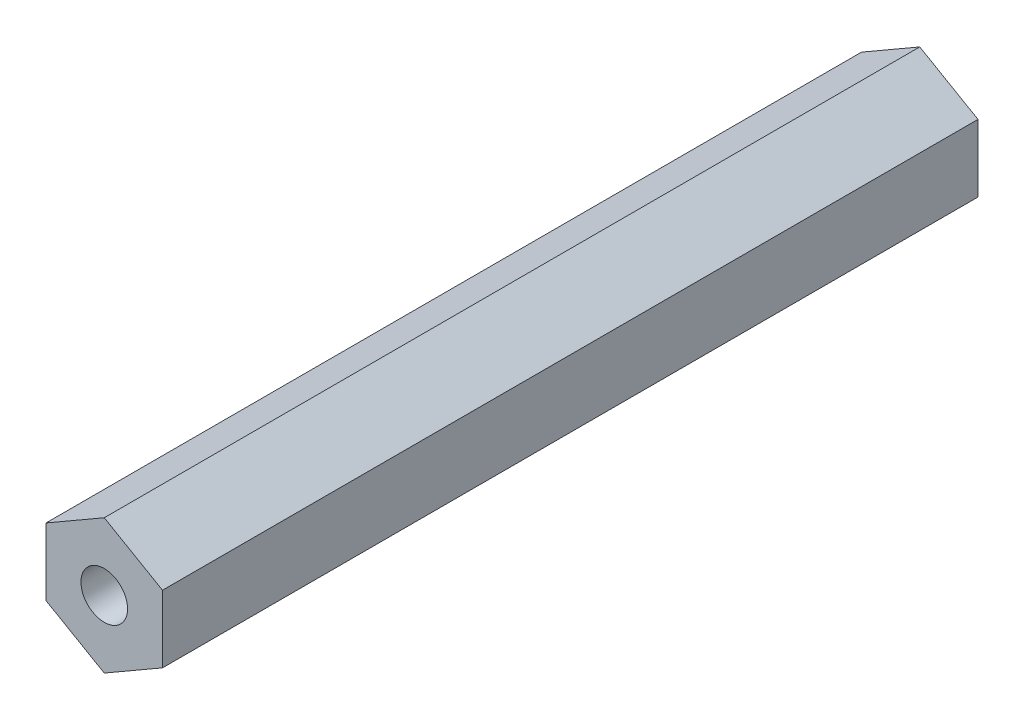
ISO-10303-21;
HEADER;
FILE_DESCRIPTION(('STEP AP214'),'2;1');
FILE_NAME('part.step','',(''),(''),'','','');
FILE_SCHEMA(('AUTOMOTIVE_DESIGN { 1 0 10303 214 1 1 1 1 }'));
ENDSEC;
DATA;
#1=APPLICATION_CONTEXT('core data for automotive mechanical design processes');
#2=APPLICATION_PROTOCOL_DEFINITION('international standard','automotive_design',2000,#1);
#3=PRODUCT_CONTEXT('',#1,'mechanical');
#4=PRODUCT('Part','Part','',(#3));
#5=PRODUCT_RELATED_PRODUCT_CATEGORY('part','',(#4));
#6=PRODUCT_DEFINITION_FORMATION('','',#4);
#7=PRODUCT_DEFINITION_CONTEXT('part definition',#1,'design');
#8=PRODUCT_DEFINITION('design','',#6,#7);
#9=PRODUCT_DEFINITION_SHAPE('','',#8);
#10=(LENGTH_UNIT() NAMED_UNIT(*) SI_UNIT(.MILLI.,.METRE.));
#11=(NAMED_UNIT(*) PLANE_ANGLE_UNIT() SI_UNIT($,.RADIAN.));
#12=(NAMED_UNIT(*) SI_UNIT($,.STERADIAN.) SOLID_ANGLE_UNIT());
#13=UNCERTAINTY_MEASURE_WITH_UNIT(LENGTH_MEASURE(1.E-05),#10,'distance_accuracy_value','');
#14=(GEOMETRIC_REPRESENTATION_CONTEXT(3) GLOBAL_UNCERTAINTY_ASSIGNED_CONTEXT((#13)) GLOBAL_UNIT_ASSIGNED_CONTEXT((#10,
#11,#12)) REPRESENTATION_CONTEXT('',''));
#15=CARTESIAN_POINT('',(0.,0.,0.));
#16=DIRECTION('',(0.,0.,1.));
#17=DIRECTION('',(1.,0.,0.));
#18=AXIS2_PLACEMENT_3D('',#15,#16,#17);
#19=CARTESIAN_POINT('',(0.,0.,35.));
#20=DIRECTION('',(0.,0.,1.));
#21=DIRECTION('',(1.,0.,0.));
#22=AXIS2_PLACEMENT_3D('',#19,#20,#21);
#23=PLANE('',#22);
#24=DIRECTION('',(-0.866025403784441,0.499999999999995,0.));
#25=VECTOR('',#24,1.);
#26=CARTESIAN_POINT('',(2.49999999999998,1.44337567297409,35.));
#27=LINE('',#26,#25);
#28=CARTESIAN_POINT('',(2.49999999999998,1.44337567297409,35.));
#29=VERTEX_POINT('',#28);
#30=CARTESIAN_POINT('',(0.,2.88675134594813,35.));
#31=VERTEX_POINT('',#30);
#32=EDGE_CURVE('E150',#29,#31,#27,.T.);
#33=ORIENTED_EDGE('',*,*,#32,.T.);
#34=DIRECTION('',(-0.866025403784438,-0.500000000000001,0.));
#35=VECTOR('',#34,1.);
#36=CARTESIAN_POINT('',(0.,2.88675134594813,35.));
#37=LINE('',#36,#35);
#38=CARTESIAN_POINT('',(-2.5,1.44337567297406,35.));
#39=VERTEX_POINT('',#38);
#40=EDGE_CURVE('E98',#31,#39,#37,.T.);
#41=ORIENTED_EDGE('',*,*,#40,.T.);
#42=DIRECTION('',(0.,-1.,0.));
#43=VECTOR('',#42,1.);
#44=CARTESIAN_POINT('',(-2.5,1.44337567297406,35.));
#45=LINE('',#44,#43);
#46=CARTESIAN_POINT('',(-2.49999999999999,-1.44337567297408,35.));
#47=VERTEX_POINT('',#46);
#48=EDGE_CURVE('E111',#39,#47,#45,.T.);
#49=ORIENTED_EDGE('',*,*,#48,.T.);
#50=DIRECTION('',(0.866025403784442,-0.499999999999995,0.));
#51=VECTOR('',#50,1.);
#52=CARTESIAN_POINT('',(-2.49999999999999,-1.44337567297408,35.));
#53=LINE('',#52,#51);
#54=CARTESIAN_POINT('',(0.,-2.88675134594813,35.));
#55=VERTEX_POINT('',#54);
#56=EDGE_CURVE('E105',#47,#55,#53,.T.);
#57=ORIENTED_EDGE('',*,*,#56,.T.);
#58=DIRECTION('',(0.866025403784435,0.500000000000007,0.));
#59=VECTOR('',#58,1.);
#60=CARTESIAN_POINT('',(0.,-2.88675134594813,35.));
#61=LINE('',#60,#59);
#62=CARTESIAN_POINT('',(2.50000000000001,-1.44337567297404,35.));
#63=VERTEX_POINT('',#62);
#64=EDGE_CURVE('E109',#55,#63,#61,.T.);
#65=ORIENTED_EDGE('',*,*,#64,.T.);
#66=DIRECTION('',(0.,1.,0.));
#67=VECTOR('',#66,1.);
#68=CARTESIAN_POINT('',(2.50000000000001,-1.44337567297404,35.));
#69=LINE('',#68,#67);
#70=EDGE_CURVE('E61',#63,#29,#69,.T.);
#71=ORIENTED_EDGE('',*,*,#70,.T.);
#72=EDGE_LOOP('',(#33,#41,#49,#57,#65,#71));
#73=FACE_BOUND('',#72,.T.);
#74=CARTESIAN_POINT('',(0.,0.,35.));
#75=DIRECTION('',(0.,0.,1.));
#76=DIRECTION('',(1.,0.,0.));
#77=AXIS2_PLACEMENT_3D('',#74,#75,#76);
#78=CIRCLE('',#77,1.);
#79=CARTESIAN_POINT('',(1.,0.,35.));
#80=VERTEX_POINT('',#79);
#81=EDGE_CURVE('E138',#80,#80,#78,.T.);
#82=ORIENTED_EDGE('',*,*,#81,.F.);
#83=EDGE_LOOP('',(#82));
#84=FACE_BOUND('',#83,.T.);
#85=ADVANCED_FACE('F43',(#73,#84),#23,.T.);
#86=CARTESIAN_POINT('',(0.,0.,0.));
#87=DIRECTION('',(0.,0.,1.));
#88=DIRECTION('',(1.,0.,0.));
#89=AXIS2_PLACEMENT_3D('',#86,#87,#88);
#90=PLANE('',#89);
#91=DIRECTION('',(-0.866025403784441,0.499999999999995,0.));
#92=VECTOR('',#91,1.);
#93=CARTESIAN_POINT('',(2.49999999999998,1.44337567297409,0.));
#94=LINE('',#93,#92);
#95=CARTESIAN_POINT('',(2.49999999999998,1.44337567297409,0.));
#96=VERTEX_POINT('',#95);
#97=CARTESIAN_POINT('',(0.,2.88675134594813,0.));
#98=VERTEX_POINT('',#97);
#99=EDGE_CURVE('E133',#96,#98,#94,.T.);
#100=ORIENTED_EDGE('',*,*,#99,.F.);
#101=DIRECTION('',(0.,1.,0.));
#102=VECTOR('',#101,1.);
#103=CARTESIAN_POINT('',(2.50000000000001,-1.44337567297404,0.));
#104=LINE('',#103,#102);
#105=CARTESIAN_POINT('',(2.50000000000001,-1.44337567297404,0.));
#106=VERTEX_POINT('',#105);
#107=EDGE_CURVE('E90',#106,#96,#104,.T.);
#108=ORIENTED_EDGE('',*,*,#107,.F.);
#109=DIRECTION('',(0.866025403784435,0.500000000000007,0.));
#110=VECTOR('',#109,1.);
#111=CARTESIAN_POINT('',(0.,-2.88675134594813,0.));
#112=LINE('',#111,#110);
#113=CARTESIAN_POINT('',(0.,-2.88675134594813,0.));
#114=VERTEX_POINT('',#113);
#115=EDGE_CURVE('E84',#114,#106,#112,.T.);
#116=ORIENTED_EDGE('',*,*,#115,.F.);
#117=DIRECTION('',(0.866025403784442,-0.499999999999995,0.));
#118=VECTOR('',#117,1.);
#119=CARTESIAN_POINT('',(-2.49999999999999,-1.44337567297408,0.));
#120=LINE('',#119,#118);
#121=CARTESIAN_POINT('',(-2.49999999999999,-1.44337567297408,0.));
#122=VERTEX_POINT('',#121);
#123=EDGE_CURVE('E120',#122,#114,#120,.T.);
#124=ORIENTED_EDGE('',*,*,#123,.F.);
#125=DIRECTION('',(0.,-1.,0.));
#126=VECTOR('',#125,1.);
#127=CARTESIAN_POINT('',(-2.5,1.44337567297406,0.));
#128=LINE('',#127,#126);
#129=CARTESIAN_POINT('',(-2.5,1.44337567297406,0.));
#130=VERTEX_POINT('',#129);
#131=EDGE_CURVE('E141',#130,#122,#128,.T.);
#132=ORIENTED_EDGE('',*,*,#131,.F.);
#133=DIRECTION('',(-0.866025403784438,-0.500000000000001,0.));
#134=VECTOR('',#133,1.);
#135=CARTESIAN_POINT('',(0.,2.88675134594813,0.));
#136=LINE('',#135,#134);
#137=EDGE_CURVE('E137',#98,#130,#136,.T.);
#138=ORIENTED_EDGE('',*,*,#137,.F.);
#139=EDGE_LOOP('',(#100,#108,#116,#124,#132,#138));
#140=FACE_BOUND('',#139,.T.);
#141=CARTESIAN_POINT('',(0.,0.,0.));
#142=DIRECTION('',(0.,0.,1.));
#143=DIRECTION('',(1.,0.,0.));
#144=AXIS2_PLACEMENT_3D('',#141,#142,#143);
#145=CIRCLE('',#144,1.);
#146=CARTESIAN_POINT('',(1.,0.,0.));
#147=VERTEX_POINT('',#146);
#148=EDGE_CURVE('E265',#147,#147,#145,.T.);
#149=ORIENTED_EDGE('',*,*,#148,.T.);
#150=EDGE_LOOP('',(#149));
#151=FACE_BOUND('',#150,.T.);
#152=ADVANCED_FACE('F163',(#140,#151),#90,.F.);
#153=CARTESIAN_POINT('',(2.49999999999998,1.44337567297409,35.));
#154=DIRECTION('',(-0.499999999999995,-0.866025403784441,0.));
#155=DIRECTION('',(0.866025403784441,-0.499999999999995,0.));
#156=AXIS2_PLACEMENT_3D('',#153,#154,#155);
#157=PLANE('',#156);
#158=ORIENTED_EDGE('',*,*,#99,.T.);
#159=DIRECTION('',(0.,0.,-1.));
#160=VECTOR('',#159,1.);
#161=CARTESIAN_POINT('',(0.,2.88675134594813,35.));
#162=LINE('',#161,#160);
#163=EDGE_CURVE('E11',#31,#98,#162,.T.);
#164=ORIENTED_EDGE('',*,*,#163,.F.);
#165=ORIENTED_EDGE('',*,*,#32,.F.);
#166=DIRECTION('',(0.,0.,-1.));
#167=VECTOR('',#166,1.);
#168=CARTESIAN_POINT('',(2.49999999999998,1.44337567297409,35.));
#169=LINE('',#168,#167);
#170=EDGE_CURVE('E129',#29,#96,#169,.T.);
#171=ORIENTED_EDGE('',*,*,#170,.T.);
#172=EDGE_LOOP('',(#158,#164,#165,#171));
#173=FACE_BOUND('',#172,.T.);
#174=ADVANCED_FACE('F45',(#173),#157,.F.);
#175=CARTESIAN_POINT('',(0.,2.88675134594813,35.));
#176=DIRECTION('',(0.500000000000001,-0.866025403784438,0.));
#177=DIRECTION('',(0.866025403784438,0.500000000000001,0.));
#178=AXIS2_PLACEMENT_3D('',#175,#176,#177);
#179=PLANE('',#178);
#180=ORIENTED_EDGE('',*,*,#137,.T.);
#181=DIRECTION('',(0.,0.,-1.));
#182=VECTOR('',#181,1.);
#183=CARTESIAN_POINT('',(-2.5,1.44337567297406,35.));
#184=LINE('',#183,#182);
#185=EDGE_CURVE('E53',#39,#130,#184,.T.);
#186=ORIENTED_EDGE('',*,*,#185,.F.);
#187=ORIENTED_EDGE('',*,*,#40,.F.);
#188=ORIENTED_EDGE('',*,*,#163,.T.);
#189=EDGE_LOOP('',(#180,#186,#187,#188));
#190=FACE_BOUND('',#189,.T.);
#191=ADVANCED_FACE('F188',(#190),#179,.F.);
#192=CARTESIAN_POINT('',(-2.5,1.44337567297406,35.));
#193=DIRECTION('',(1.,0.,0.));
#194=DIRECTION('',(0.,1.,0.));
#195=AXIS2_PLACEMENT_3D('',#192,#193,#194);
#196=PLANE('',#195);
#197=ORIENTED_EDGE('',*,*,#131,.T.);
#198=DIRECTION('',(0.,0.,-1.));
#199=VECTOR('',#198,1.);
#200=CARTESIAN_POINT('',(-2.49999999999999,-1.44337567297408,35.));
#201=LINE('',#200,#199);
#202=EDGE_CURVE('E122',#47,#122,#201,.T.);
#203=ORIENTED_EDGE('',*,*,#202,.F.);
#204=ORIENTED_EDGE('',*,*,#48,.F.);
#205=ORIENTED_EDGE('',*,*,#185,.T.);
#206=EDGE_LOOP('',(#197,#203,#204,#205));
#207=FACE_BOUND('',#206,.T.);
#208=ADVANCED_FACE('F160',(#207),#196,.F.);
#209=CARTESIAN_POINT('',(-2.49999999999999,-1.44337567297408,35.));
#210=DIRECTION('',(0.499999999999995,0.866025403784441,0.));
#211=DIRECTION('',(-0.866025403784442,0.499999999999995,0.));
#212=AXIS2_PLACEMENT_3D('',#209,#210,#211);
#213=PLANE('',#212);
#214=ORIENTED_EDGE('',*,*,#123,.T.);
#215=DIRECTION('',(0.,0.,-1.));
#216=VECTOR('',#215,1.);
#217=CARTESIAN_POINT('',(0.,-2.88675134594813,35.));
#218=LINE('',#217,#216);
#219=EDGE_CURVE('E117',#55,#114,#218,.T.);
#220=ORIENTED_EDGE('',*,*,#219,.F.);
#221=ORIENTED_EDGE('',*,*,#56,.F.);
#222=ORIENTED_EDGE('',*,*,#202,.T.);
#223=EDGE_LOOP('',(#214,#220,#221,#222));
#224=FACE_BOUND('',#223,.T.);
#225=ADVANCED_FACE('F118',(#224),#213,.F.);
#226=CARTESIAN_POINT('',(0.,-2.88675134594813,35.));
#227=DIRECTION('',(-0.500000000000007,0.866025403784434,0.));
#228=DIRECTION('',(-0.866025403784435,-0.500000000000007,0.));
#229=AXIS2_PLACEMENT_3D('',#226,#227,#228);
#230=PLANE('',#229);
#231=ORIENTED_EDGE('',*,*,#115,.T.);
#232=DIRECTION('',(0.,0.,-1.));
#233=VECTOR('',#232,1.);
#234=CARTESIAN_POINT('',(2.50000000000001,-1.44337567297404,35.));
#235=LINE('',#234,#233);
#236=EDGE_CURVE('E123',#63,#106,#235,.T.);
#237=ORIENTED_EDGE('',*,*,#236,.F.);
#238=ORIENTED_EDGE('',*,*,#64,.F.);
#239=ORIENTED_EDGE('',*,*,#219,.T.);
#240=EDGE_LOOP('',(#231,#237,#238,#239));
#241=FACE_BOUND('',#240,.T.);
#242=ADVANCED_FACE('F125',(#241),#230,.F.);
#243=CARTESIAN_POINT('',(2.50000000000001,-1.44337567297404,35.));
#244=DIRECTION('',(-1.,0.,0.));
#245=DIRECTION('',(0.,-1.,0.));
#246=AXIS2_PLACEMENT_3D('',#243,#244,#245);
#247=PLANE('',#246);
#248=ORIENTED_EDGE('',*,*,#107,.T.);
#249=ORIENTED_EDGE('',*,*,#170,.F.);
#250=ORIENTED_EDGE('',*,*,#70,.F.);
#251=ORIENTED_EDGE('',*,*,#236,.T.);
#252=EDGE_LOOP('',(#248,#249,#250,#251));
#253=FACE_BOUND('',#252,.T.);
#254=ADVANCED_FACE('F168',(#253),#247,.F.);
#255=CARTESIAN_POINT('',(0.,0.,35.));
#256=DIRECTION('',(0.,0.,-1.));
#257=DIRECTION('',(-1.,0.,0.));
#258=AXIS2_PLACEMENT_3D('',#255,#256,#257);
#259=CYLINDRICAL_SURFACE('',#258,1.);
#260=ORIENTED_EDGE('',*,*,#81,.T.);
#261=EDGE_LOOP('',(#260));
#262=FACE_BOUND('',#261,.T.);
#263=ORIENTED_EDGE('',*,*,#148,.F.);
#264=EDGE_LOOP('',(#263));
#265=FACE_BOUND('',#264,.T.);
#266=ADVANCED_FACE('F170',(#262,#265),#259,.F.);
#267=CLOSED_SHELL('',(#85,#152,#174,#191,#208,#225,#242,#254,#266));
#268=MANIFOLD_SOLID_BREP('B2',#267);
#269=ADVANCED_BREP_SHAPE_REPRESENTATION('',(#18,#268),#14);
#270=SHAPE_DEFINITION_REPRESENTATION(#9,#269);
ENDSEC;
END-ISO-10303-21;
